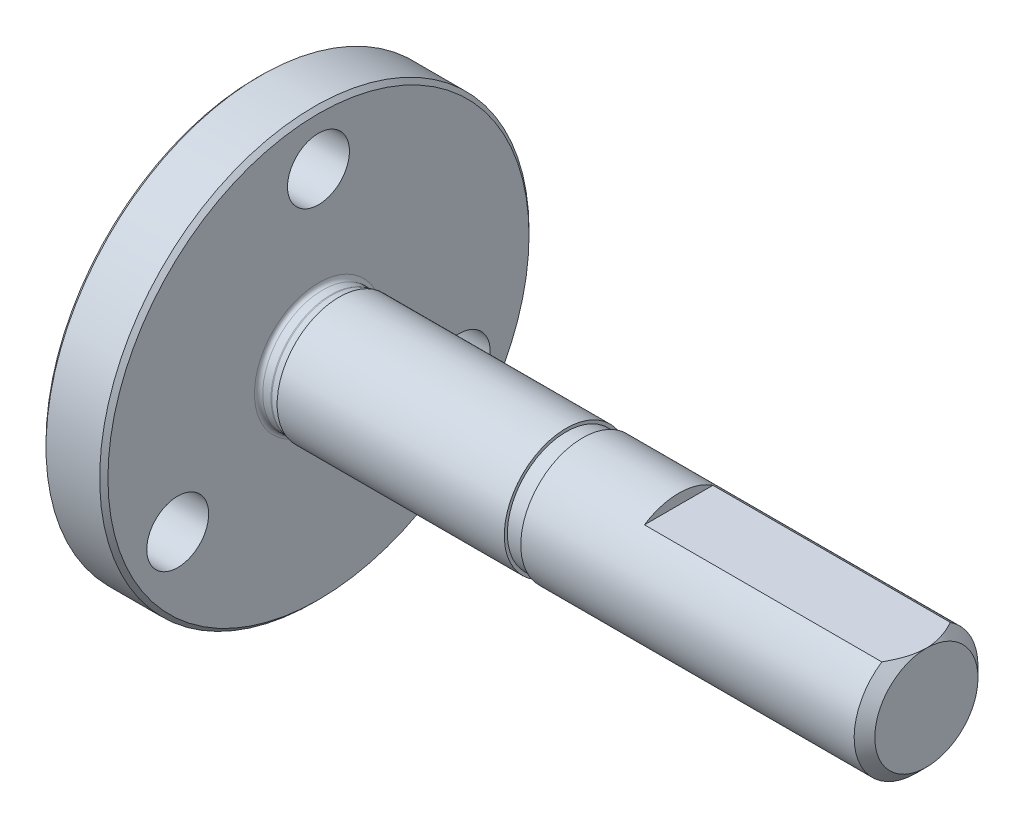
ISO-10303-21;
HEADER;
FILE_DESCRIPTION(('STEP AP214'),'2;1');
FILE_NAME('part.step','',(''),(''),'','','');
FILE_SCHEMA(('AUTOMOTIVE_DESIGN { 1 0 10303 214 1 1 1 1 }'));
ENDSEC;
DATA;
#1=APPLICATION_CONTEXT('core data for automotive mechanical design processes');
#2=APPLICATION_PROTOCOL_DEFINITION('international standard','automotive_design',2000,#1);
#3=PRODUCT_CONTEXT('',#1,'mechanical');
#4=PRODUCT('Part','Part','',(#3));
#5=PRODUCT_RELATED_PRODUCT_CATEGORY('part','',(#4));
#6=PRODUCT_DEFINITION_FORMATION('','',#4);
#7=PRODUCT_DEFINITION_CONTEXT('part definition',#1,'design');
#8=PRODUCT_DEFINITION('design','',#6,#7);
#9=PRODUCT_DEFINITION_SHAPE('','',#8);
#10=(LENGTH_UNIT() NAMED_UNIT(*) SI_UNIT(.MILLI.,.METRE.));
#11=(NAMED_UNIT(*) PLANE_ANGLE_UNIT() SI_UNIT($,.RADIAN.));
#12=(NAMED_UNIT(*) SI_UNIT($,.STERADIAN.) SOLID_ANGLE_UNIT());
#13=UNCERTAINTY_MEASURE_WITH_UNIT(LENGTH_MEASURE(1.E-05),#10,'distance_accuracy_value','');
#14=(GEOMETRIC_REPRESENTATION_CONTEXT(3) GLOBAL_UNCERTAINTY_ASSIGNED_CONTEXT((#13)) GLOBAL_UNIT_ASSIGNED_CONTEXT((#10,
#11,#12)) REPRESENTATION_CONTEXT('',''));
#15=CARTESIAN_POINT('',(0.,0.,0.));
#16=DIRECTION('',(0.,0.,1.));
#17=DIRECTION('',(1.,0.,0.));
#18=AXIS2_PLACEMENT_3D('',#15,#16,#17);
#19=CARTESIAN_POINT('',(-3.,-4.68293605380455E-11,0.));
#20=DIRECTION('',(1.,0.,0.));
#21=DIRECTION('',(0.,0.,-1.));
#22=AXIS2_PLACEMENT_3D('',#19,#20,#21);
#23=CYLINDRICAL_SURFACE('',#22,10.4);
#24=CARTESIAN_POINT('',(-0.20000000000006,-4.68293605380455E-11,0.));
#25=DIRECTION('',(1.,0.,0.));
#26=DIRECTION('',(0.,0.,-1.));
#27=AXIS2_PLACEMENT_3D('',#24,#25,#26);
#28=CIRCLE('',#27,10.4);
#29=CARTESIAN_POINT('',(-0.20000000000006,-4.68293605380455E-11,-10.4));
#30=VERTEX_POINT('',#29);
#31=EDGE_CURVE('E131',#30,#30,#28,.F.);
#32=CARTESIAN_POINT('',(-2.79999999999988,-4.68293605380455E-11,0.));
#33=DIRECTION('',(-1.,0.,0.));
#34=DIRECTION('',(0.,0.,1.));
#35=AXIS2_PLACEMENT_3D('',#32,#33,#34);
#36=CIRCLE('',#35,10.4);
#37=CARTESIAN_POINT('',(-2.79999999999988,-4.68293605380455E-11,-10.4));
#38=VERTEX_POINT('',#37);
#39=EDGE_CURVE('E128',#38,#38,#36,.F.);
#40=CARTESIAN_POINT('',(-0.20000000000006,-4.68293605380455E-11,-10.4));
#41=CARTESIAN_POINT('',(-0.227083333333391,-4.68293605380455E-11,-10.4));
#42=CARTESIAN_POINT('',(-0.254166666666723,-4.68293605380455E-11,-10.4));
#43=CARTESIAN_POINT('',(-0.308333333333386,-4.68293605380455E-11,-10.4));
#44=CARTESIAN_POINT('',(-0.335416666666717,-4.68293605380455E-11,-10.4));
#45=CARTESIAN_POINT('',(-0.38958333333338,-4.68293605380455E-11,-10.4));
#46=CARTESIAN_POINT('',(-0.416666666666712,-4.68293605380455E-11,-10.4));
#47=CARTESIAN_POINT('',(-0.470833333333375,-4.68293605380455E-11,-10.4));
#48=CARTESIAN_POINT('',(-0.497916666666706,-4.68293605380455E-11,-10.4));
#49=CARTESIAN_POINT('',(-0.55208333333337,-4.68293605380455E-11,-10.4));
#50=CARTESIAN_POINT('',(-0.579166666666701,-4.68293605380455E-11,-10.4));
#51=CARTESIAN_POINT('',(-0.633333333333364,-4.68293605380455E-11,-10.4));
#52=CARTESIAN_POINT('',(-0.660416666666696,-4.68293605380455E-11,-10.4));
#53=CARTESIAN_POINT('',(-0.714583333333359,-4.68293605380455E-11,-10.4));
#54=CARTESIAN_POINT('',(-0.74166666666669,-4.68293605380455E-11,-10.4));
#55=CARTESIAN_POINT('',(-0.795833333333353,-4.68293605380455E-11,-10.4));
#56=CARTESIAN_POINT('',(-0.822916666666685,-4.68293605380455E-11,-10.4));
#57=CARTESIAN_POINT('',(-0.877083333333348,-4.68293605380455E-11,-10.4));
#58=CARTESIAN_POINT('',(-0.904166666666679,-4.68293605380455E-11,-10.4));
#59=CARTESIAN_POINT('',(-0.958333333333342,-4.68293605380455E-11,-10.4));
#60=CARTESIAN_POINT('',(-0.985416666666674,-4.68293605380455E-11,-10.4));
#61=CARTESIAN_POINT('',(-1.03958333333334,-4.68293605380455E-11,-10.4));
#62=CARTESIAN_POINT('',(-1.06666666666667,-4.68293605380455E-11,-10.4));
#63=CARTESIAN_POINT('',(-1.12083333333333,-4.68293605380455E-11,-10.4));
#64=CARTESIAN_POINT('',(-1.14791666666666,-4.68293605380455E-11,-10.4));
#65=CARTESIAN_POINT('',(-1.20208333333333,-4.68293605380455E-11,-10.4));
#66=CARTESIAN_POINT('',(-1.22916666666666,-4.68293605380455E-11,-10.4));
#67=CARTESIAN_POINT('',(-1.28333333333332,-4.68293605380455E-11,-10.4));
#68=CARTESIAN_POINT('',(-1.31041666666665,-4.68293605380455E-11,-10.4));
#69=CARTESIAN_POINT('',(-1.36458333333331,-4.68293605380455E-11,-10.4));
#70=CARTESIAN_POINT('',(-1.39166666666665,-4.68293605380455E-11,-10.4));
#71=CARTESIAN_POINT('',(-1.44583333333331,-4.68293605380455E-11,-10.4));
#72=CARTESIAN_POINT('',(-1.47291666666664,-4.68293605380455E-11,-10.4));
#73=CARTESIAN_POINT('',(-1.5270833333333,-4.68293605380455E-11,-10.4));
#74=CARTESIAN_POINT('',(-1.55416666666663,-4.68293605380455E-11,-10.4));
#75=CARTESIAN_POINT('',(-1.6083333333333,-4.68293605380455E-11,-10.4));
#76=CARTESIAN_POINT('',(-1.63541666666663,-4.68293605380455E-11,-10.4));
#77=CARTESIAN_POINT('',(-1.68958333333329,-4.68293605380455E-11,-10.4));
#78=CARTESIAN_POINT('',(-1.71666666666662,-4.68293605380455E-11,-10.4));
#79=CARTESIAN_POINT('',(-1.77083333333329,-4.68293605380455E-11,-10.4));
#80=CARTESIAN_POINT('',(-1.79791666666662,-4.68293605380455E-11,-10.4));
#81=CARTESIAN_POINT('',(-1.85208333333328,-4.68293605380455E-11,-10.4));
#82=CARTESIAN_POINT('',(-1.87916666666661,-4.68293605380455E-11,-10.4));
#83=CARTESIAN_POINT('',(-1.93333333333328,-4.68293605380455E-11,-10.4));
#84=CARTESIAN_POINT('',(-1.96041666666661,-4.68293605380455E-11,-10.4));
#85=CARTESIAN_POINT('',(-2.01458333333327,-4.68293605380455E-11,-10.4));
#86=CARTESIAN_POINT('',(-2.0416666666666,-4.68293605380455E-11,-10.4));
#87=CARTESIAN_POINT('',(-2.09583333333327,-4.68293605380455E-11,-10.4));
#88=CARTESIAN_POINT('',(-2.1229166666666,-4.68293605380455E-11,-10.4));
#89=CARTESIAN_POINT('',(-2.17708333333326,-4.68293605380455E-11,-10.4));
#90=CARTESIAN_POINT('',(-2.20416666666659,-4.68293605380455E-11,-10.4));
#91=CARTESIAN_POINT('',(-2.25833333333325,-4.68293605380455E-11,-10.4));
#92=CARTESIAN_POINT('',(-2.28541666666659,-4.68293605380455E-11,-10.4));
#93=CARTESIAN_POINT('',(-2.33958333333325,-4.68293605380455E-11,-10.4));
#94=CARTESIAN_POINT('',(-2.36666666666658,-4.68293605380455E-11,-10.4));
#95=CARTESIAN_POINT('',(-2.42083333333324,-4.68293605380455E-11,-10.4));
#96=CARTESIAN_POINT('',(-2.44791666666657,-4.68293605380455E-11,-10.4));
#97=CARTESIAN_POINT('',(-2.50208333333324,-4.68293605380455E-11,-10.4));
#98=CARTESIAN_POINT('',(-2.52916666666657,-4.68293605380455E-11,-10.4));
#99=CARTESIAN_POINT('',(-2.58333333333323,-4.68293605380455E-11,-10.4));
#100=CARTESIAN_POINT('',(-2.61041666666656,-4.68293605380455E-11,-10.4));
#101=CARTESIAN_POINT('',(-2.66458333333323,-4.68293605380455E-11,-10.4));
#102=CARTESIAN_POINT('',(-2.69166666666656,-4.68293605380455E-11,-10.4));
#103=CARTESIAN_POINT('',(-2.74583333333322,-4.68293605380455E-11,-10.4));
#104=CARTESIAN_POINT('',(-2.77291666666655,-4.68293605380455E-11,-10.4));
#105=CARTESIAN_POINT('',(-2.79999999999988,-4.68293605380455E-11,-10.4));
#106=B_SPLINE_CURVE_WITH_KNOTS('',3,(#40,#41,#42,#43,#44,#45,#46,#47,#48,#49,#50,#51,#52,#53,
#54,#55,#56,#57,#58,#59,#60,#61,#62,#63,#64,#65,#66,#67,#68,#69,#70,#71,#72,#73,#74,#75,#76,#77,
#78,#79,#80,#81,#82,#83,#84,#85,#86,#87,#88,#89,#90,#91,#92,#93,#94,#95,#96,#97,#98,#99,#100,
#101,#102,#103,#104,#105),.UNSPECIFIED.,.F.,.F.,(4,2,2,2,2,2,2,2,2,2,2,2,2,2,2,2,2,2,2,2,2,2,2,
2,2,2,2,2,2,2,2,2,4),(0.,0.0812499999999945,0.162499999999989,0.243749999999984,
0.324999999999978,0.406249999999973,0.487499999999967,0.568749999999962,0.649999999999956,
0.731249999999951,0.812499999999945,0.893749999999939,0.974999999999934,1.05624999999993,
1.13749999999992,1.21874999999992,1.29999999999991,1.38124999999991,1.4624999999999,
1.5437499999999,1.62499999999989,1.70624999999988,1.78749999999988,1.86874999999987,
1.94999999999987,2.03124999999986,2.11249999999986,2.19374999999985,2.27499999999985,
2.35624999999984,2.43749999999983,2.51874999999983,2.59999999999982),.UNSPECIFIED.);
#107=EDGE_CURVE('BSEAM47',#30,#38,#106,.T.);
#108=ORIENTED_EDGE('',*,*,#31,.T.);
#109=ORIENTED_EDGE('',*,*,#39,.T.);
#110=ORIENTED_EDGE('',*,*,#107,.T.);
#111=ORIENTED_EDGE('',*,*,#107,.F.);
#112=EDGE_LOOP('',(#108,#110,#109,#111));
#113=FACE_BOUND('',#112,.T.);
#114=ADVANCED_FACE('F47',(#113),#23,.T.);
#115=CARTESIAN_POINT('',(-3.,10.3999999999532,0.));
#116=DIRECTION('',(-1.,0.,0.));
#117=DIRECTION('',(0.,0.,1.));
#118=AXIS2_PLACEMENT_3D('',#115,#116,#117);
#119=PLANE('',#118);
#120=CARTESIAN_POINT('',(-3.,-3.9375,-6.819950054802));
#121=DIRECTION('',(-1.,0.,0.));
#122=DIRECTION('',(0.,0.,1.));
#123=AXIS2_PLACEMENT_3D('',#120,#121,#122);
#124=CIRCLE('',#123,1.67320508078337);
#125=CARTESIAN_POINT('',(-3.,-3.9375,-5.14674497401863));
#126=VERTEX_POINT('',#125);
#127=EDGE_CURVE('E149',#126,#126,#124,.F.);
#128=ORIENTED_EDGE('',*,*,#127,.T.);
#129=EDGE_LOOP('',(#128));
#130=FACE_BOUND('',#129,.T.);
#131=CARTESIAN_POINT('',(-3.,-3.9375,6.819950054802));
#132=DIRECTION('',(-1.,0.,0.));
#133=DIRECTION('',(0.,0.,1.));
#134=AXIS2_PLACEMENT_3D('',#131,#132,#133);
#135=CIRCLE('',#134,1.67320508078337);
#136=CARTESIAN_POINT('',(-3.,-3.9375,8.49315513558537));
#137=VERTEX_POINT('',#136);
#138=EDGE_CURVE('E146',#137,#137,#135,.F.);
#139=ORIENTED_EDGE('',*,*,#138,.T.);
#140=EDGE_LOOP('',(#139));
#141=FACE_BOUND('',#140,.T.);
#142=CARTESIAN_POINT('',(-3.,7.875,0.));
#143=DIRECTION('',(-1.,0.,0.));
#144=DIRECTION('',(0.,0.,1.));
#145=AXIS2_PLACEMENT_3D('',#142,#143,#144);
#146=CIRCLE('',#145,1.67320508075305);
#147=CARTESIAN_POINT('',(-3.,7.875,1.67320508075305));
#148=VERTEX_POINT('',#147);
#149=EDGE_CURVE('E140',#148,#148,#146,.F.);
#150=ORIENTED_EDGE('',*,*,#149,.T.);
#151=EDGE_LOOP('',(#150));
#152=FACE_BOUND('',#151,.T.);
#153=CARTESIAN_POINT('',(-3.,-4.68293605380455E-11,0.));
#154=DIRECTION('',(-1.,0.,0.));
#155=DIRECTION('',(0.,0.,1.));
#156=AXIS2_PLACEMENT_3D('',#153,#154,#155);
#157=CIRCLE('',#156,10.1999999999999);
#158=CARTESIAN_POINT('',(-3.,-4.68293605380455E-11,-10.1999999999999));
#159=VERTEX_POINT('',#158);
#160=EDGE_CURVE('E134',#159,#159,#157,.T.);
#161=ORIENTED_EDGE('',*,*,#160,.T.);
#162=EDGE_LOOP('',(#161));
#163=FACE_BOUND('',#162,.T.);
#164=CARTESIAN_POINT('',(-3.,0.,0.));
#165=DIRECTION('',(-1.,0.,0.));
#166=DIRECTION('',(0.,0.,1.));
#167=AXIS2_PLACEMENT_3D('',#164,#165,#166);
#168=CIRCLE('',#167,5.00000000002389);
#169=CARTESIAN_POINT('',(-3.,0.,5.00000000002389));
#170=VERTEX_POINT('',#169);
#171=EDGE_CURVE('E89',#170,#170,#168,.T.);
#172=ORIENTED_EDGE('',*,*,#171,.F.);
#173=EDGE_LOOP('',(#172));
#174=FACE_BOUND('',#173,.T.);
#175=ADVANCED_FACE('F212',(#130,#141,#152,#163,#174),#119,.T.);
#176=CARTESIAN_POINT('',(29.45,-4.68293605380455E-11,0.));
#177=DIRECTION('',(1.,0.,0.));
#178=DIRECTION('',(0.,0.,-1.));
#179=AXIS2_PLACEMENT_3D('',#176,#177,#178);
#180=PLANE('',#179);
#181=CARTESIAN_POINT('',(29.45,-4.68293605380455E-11,0.));
#182=DIRECTION('',(1.,0.,0.));
#183=DIRECTION('',(0.,0.,-1.));
#184=AXIS2_PLACEMENT_3D('',#181,#182,#183);
#185=CIRCLE('',#184,2.50000000001932);
#186=CARTESIAN_POINT('',(29.45,2.49999999997249,0.));
#187=VERTEX_POINT('',#186);
#188=EDGE_CURVE('E119',#187,#187,#185,.T.);
#189=ORIENTED_EDGE('',*,*,#188,.T.);
#190=EDGE_LOOP('',(#189));
#191=FACE_BOUND('',#190,.T.);
#192=ADVANCED_FACE('F217',(#191),#180,.T.);
#193=CARTESIAN_POINT('',(-3.,-4.68293605380455E-11,0.));
#194=DIRECTION('',(1.,0.,0.));
#195=DIRECTION('',(0.,0.,-1.));
#196=AXIS2_PLACEMENT_3D('',#193,#194,#195);
#197=CYLINDRICAL_SURFACE('',#196,3.00000000004683);
#198=DIRECTION('',(1.,0.,0.));
#199=VECTOR('',#198,1.);
#200=CARTESIAN_POINT('',(-3.,2.5,-1.65831239519182));
#201=LINE('',#200,#199);
#202=CARTESIAN_POINT('',(28.9500000000862,2.5,-1.65831239519182));
#203=VERTEX_POINT('',#202);
#204=CARTESIAN_POINT('',(17.45,2.5,-1.65831239519182));
#205=VERTEX_POINT('',#204);
#206=EDGE_CURVE('E81',#203,#205,#201,.F.);
#207=ORIENTED_EDGE('',*,*,#206,.F.);
#208=CARTESIAN_POINT('',(28.9500000000862,-4.68293605380455E-11,0.));
#209=DIRECTION('',(1.,0.,0.));
#210=DIRECTION('',(0.,0.,-1.));
#211=AXIS2_PLACEMENT_3D('',#208,#209,#210);
#212=CIRCLE('',#211,3.00000000004683);
#213=CARTESIAN_POINT('',(28.9500000000862,2.5,1.65831239519182));
#214=VERTEX_POINT('',#213);
#215=EDGE_CURVE('E87',#203,#214,#212,.F.);
#216=ORIENTED_EDGE('',*,*,#215,.T.);
#217=DIRECTION('',(1.,0.,0.));
#218=VECTOR('',#217,1.);
#219=CARTESIAN_POINT('',(-3.,2.5,1.65831239519182));
#220=LINE('',#219,#218);
#221=CARTESIAN_POINT('',(17.45,2.5,1.65831239519182));
#222=VERTEX_POINT('',#221);
#223=EDGE_CURVE('E66',#222,#214,#220,.T.);
#224=ORIENTED_EDGE('',*,*,#223,.F.);
#225=CARTESIAN_POINT('',(17.45,-4.68293605380455E-11,0.));
#226=DIRECTION('',(-1.,0.,0.));
#227=DIRECTION('',(0.,0.,1.));
#228=AXIS2_PLACEMENT_3D('',#225,#226,#227);
#229=CIRCLE('',#228,3.00000000004683);
#230=EDGE_CURVE('E13',#205,#222,#229,.F.);
#231=ORIENTED_EDGE('',*,*,#230,.F.);
#232=EDGE_LOOP('',(#207,#216,#224,#231));
#233=FACE_BOUND('',#232,.T.);
#234=CARTESIAN_POINT('',(12.8,-4.68293605380455E-11,0.));
#235=DIRECTION('',(1.,0.,0.));
#236=DIRECTION('',(0.,0.,-1.));
#237=AXIS2_PLACEMENT_3D('',#234,#235,#236);
#238=CIRCLE('',#237,3.00000000004683);
#239=CARTESIAN_POINT('',(12.8,-4.68293605380455E-11,-3.00000000004683));
#240=VERTEX_POINT('',#239);
#241=EDGE_CURVE('E116',#240,#240,#238,.T.);
#242=ORIENTED_EDGE('',*,*,#241,.T.);
#243=EDGE_LOOP('',(#242));
#244=FACE_BOUND('',#243,.T.);
#245=ADVANCED_FACE('F84',(#233,#244),#197,.T.);
#246=CARTESIAN_POINT('',(12.8,3.,0.));
#247=DIRECTION('',(-1.,0.,0.));
#248=DIRECTION('',(0.,0.,1.));
#249=AXIS2_PLACEMENT_3D('',#246,#247,#248);
#250=PLANE('',#249);
#251=CARTESIAN_POINT('',(12.8,-4.68293605380455E-11,0.));
#252=DIRECTION('',(1.,0.,0.));
#253=DIRECTION('',(0.,0.,-1.));
#254=AXIS2_PLACEMENT_3D('',#251,#252,#253);
#255=CIRCLE('',#254,2.85000000004683);
#256=CARTESIAN_POINT('',(12.8,-4.68293605380455E-11,-2.85000000004683));
#257=VERTEX_POINT('',#256);
#258=EDGE_CURVE('E113',#257,#257,#255,.T.);
#259=ORIENTED_EDGE('',*,*,#258,.T.);
#260=EDGE_LOOP('',(#259));
#261=FACE_BOUND('',#260,.T.);
#262=ORIENTED_EDGE('',*,*,#241,.F.);
#263=EDGE_LOOP('',(#262));
#264=FACE_BOUND('',#263,.T.);
#265=ADVANCED_FACE('F269',(#261,#264),#250,.T.);
#266=CARTESIAN_POINT('',(-3.,-4.68293605380455E-11,0.));
#267=DIRECTION('',(1.,0.,0.));
#268=DIRECTION('',(0.,0.,-1.));
#269=AXIS2_PLACEMENT_3D('',#266,#267,#268);
#270=CYLINDRICAL_SURFACE('',#269,2.85000000004683);
#271=CARTESIAN_POINT('',(12.,-4.68293605380455E-11,0.));
#272=DIRECTION('',(1.,0.,0.));
#273=DIRECTION('',(0.,0.,-1.));
#274=AXIS2_PLACEMENT_3D('',#271,#272,#273);
#275=CIRCLE('',#274,2.85000000004683);
#276=CARTESIAN_POINT('',(12.,-4.68293605380455E-11,-2.85000000004683));
#277=VERTEX_POINT('',#276);
#278=EDGE_CURVE('E110',#277,#277,#275,.T.);
#279=ORIENTED_EDGE('',*,*,#278,.T.);
#280=EDGE_LOOP('',(#279));
#281=FACE_BOUND('',#280,.T.);
#282=ORIENTED_EDGE('',*,*,#258,.F.);
#283=EDGE_LOOP('',(#282));
#284=FACE_BOUND('',#283,.T.);
#285=ADVANCED_FACE('F265',(#281,#284),#270,.T.);
#286=CARTESIAN_POINT('',(12.,2.85,0.));
#287=DIRECTION('',(1.,0.,0.));
#288=DIRECTION('',(0.,0.,-1.));
#289=AXIS2_PLACEMENT_3D('',#286,#287,#288);
#290=PLANE('',#289);
#291=CARTESIAN_POINT('',(12.,-4.68293605380455E-11,0.));
#292=DIRECTION('',(1.,0.,0.));
#293=DIRECTION('',(0.,0.,-1.));
#294=AXIS2_PLACEMENT_3D('',#291,#292,#293);
#295=CIRCLE('',#294,3.00000000004683);
#296=CARTESIAN_POINT('',(12.,-4.68293605380455E-11,-3.00000000004683));
#297=VERTEX_POINT('',#296);
#298=EDGE_CURVE('E107',#297,#297,#295,.T.);
#299=ORIENTED_EDGE('',*,*,#298,.T.);
#300=EDGE_LOOP('',(#299));
#301=FACE_BOUND('',#300,.T.);
#302=ORIENTED_EDGE('',*,*,#278,.F.);
#303=EDGE_LOOP('',(#302));
#304=FACE_BOUND('',#303,.T.);
#305=ADVANCED_FACE('F261',(#301,#304),#290,.T.);
#306=CARTESIAN_POINT('',(-3.,-4.68293605380455E-11,0.));
#307=DIRECTION('',(1.,0.,0.));
#308=DIRECTION('',(0.,0.,-1.));
#309=AXIS2_PLACEMENT_3D('',#306,#307,#308);
#310=CYLINDRICAL_SURFACE('',#309,3.00000000004683);
#311=CARTESIAN_POINT('',(0.996794919331024,-4.68293605380455E-11,0.));
#312=DIRECTION('',(1.,0.,0.));
#313=DIRECTION('',(0.,0.,-1.));
#314=AXIS2_PLACEMENT_3D('',#311,#312,#313);
#315=CIRCLE('',#314,3.00000000004683);
#316=CARTESIAN_POINT('',(0.996794919331024,-4.68293605380455E-11,-3.00000000004683));
#317=VERTEX_POINT('',#316);
#318=EDGE_CURVE('E104',#317,#317,#315,.T.);
#319=ORIENTED_EDGE('',*,*,#318,.T.);
#320=EDGE_LOOP('',(#319));
#321=FACE_BOUND('',#320,.T.);
#322=ORIENTED_EDGE('',*,*,#298,.F.);
#323=EDGE_LOOP('',(#322));
#324=FACE_BOUND('',#323,.T.);
#325=ADVANCED_FACE('F257',(#321,#324),#310,.T.);
#326=CARTESIAN_POINT('',(0.996794919331024,-4.68293605380455E-11,0.));
#327=DIRECTION('',(1.,0.,0.));
#328=DIRECTION('',(0.,0.,-1.));
#329=AXIS2_PLACEMENT_3D('',#326,#327,#328);
#330=CONICAL_SURFACE('',#329,3.00000000004683,0.26179938774434);
#331=CARTESIAN_POINT('',(0.64902314781557,-4.68293605380455E-11,0.));
#332=DIRECTION('',(1.,0.,0.));
#333=DIRECTION('',(0.,0.,-1.));
#334=AXIS2_PLACEMENT_3D('',#331,#332,#333);
#335=CIRCLE('',#334,2.90681483473935);
#336=CARTESIAN_POINT('',(0.64902314781557,-4.68293605380455E-11,-2.90681483473935));
#337=VERTEX_POINT('',#336);
#338=EDGE_CURVE('E164',#337,#337,#335,.T.);
#339=ORIENTED_EDGE('',*,*,#338,.T.);
#340=EDGE_LOOP('',(#339));
#341=FACE_BOUND('',#340,.T.);
#342=ORIENTED_EDGE('',*,*,#318,.F.);
#343=EDGE_LOOP('',(#342));
#344=FACE_BOUND('',#343,.T.);
#345=ADVANCED_FACE('F253',(#341,#344),#330,.T.);
#346=CARTESIAN_POINT('',(-3.,-4.68293605380455E-11,0.));
#347=DIRECTION('',(1.,0.,0.));
#348=DIRECTION('',(0.,0.,-1.));
#349=AXIS2_PLACEMENT_3D('',#346,#347,#348);
#350=CYLINDRICAL_SURFACE('',#349,2.9);
#351=CARTESIAN_POINT('',(0.200000000000035,-4.68293605380455E-11,0.));
#352=DIRECTION('',(1.,0.,0.));
#353=DIRECTION('',(0.,0.,-1.));
#354=AXIS2_PLACEMENT_3D('',#351,#352,#353);
#355=CIRCLE('',#354,2.9);
#356=CARTESIAN_POINT('',(0.200000000000035,-4.68293605380455E-11,-2.9));
#357=VERTEX_POINT('',#356);
#358=EDGE_CURVE('E158',#357,#357,#355,.T.);
#359=ORIENTED_EDGE('',*,*,#358,.T.);
#360=EDGE_LOOP('',(#359));
#361=FACE_BOUND('',#360,.T.);
#362=CARTESIAN_POINT('',(0.597259338805646,-4.68293605380455E-11,0.));
#363=DIRECTION('',(1.,0.,0.));
#364=DIRECTION('',(0.,0.,-1.));
#365=AXIS2_PLACEMENT_3D('',#362,#363,#364);
#366=CIRCLE('',#365,2.9);
#367=CARTESIAN_POINT('',(0.597259338805646,-4.68293605380455E-11,-2.9));
#368=VERTEX_POINT('',#367);
#369=EDGE_CURVE('E155',#368,#368,#366,.F.);
#370=ORIENTED_EDGE('',*,*,#369,.T.);
#371=EDGE_LOOP('',(#370));
#372=FACE_BOUND('',#371,.T.);
#373=ADVANCED_FACE('F230',(#361,#372),#350,.T.);
#374=CARTESIAN_POINT('',(0.,2.89999999995317,0.));
#375=DIRECTION('',(1.,0.,0.));
#376=DIRECTION('',(0.,0.,-1.));
#377=AXIS2_PLACEMENT_3D('',#374,#375,#376);
#378=PLANE('',#377);
#379=CARTESIAN_POINT('',(0.,-4.68293605380455E-11,0.));
#380=DIRECTION('',(1.,0.,0.));
#381=DIRECTION('',(0.,0.,-1.));
#382=AXIS2_PLACEMENT_3D('',#379,#380,#381);
#383=CIRCLE('',#382,3.10000000000004);
#384=CARTESIAN_POINT('',(0.,-4.68293605380455E-11,-3.10000000000004));
#385=VERTEX_POINT('',#384);
#386=EDGE_CURVE('E161',#385,#385,#383,.F.);
#387=ORIENTED_EDGE('',*,*,#386,.T.);
#388=EDGE_LOOP('',(#387));
#389=FACE_BOUND('',#388,.T.);
#390=CARTESIAN_POINT('',(0.,-4.68293605380455E-11,0.));
#391=DIRECTION('',(1.,0.,0.));
#392=DIRECTION('',(0.,0.,-1.));
#393=AXIS2_PLACEMENT_3D('',#390,#391,#392);
#394=CIRCLE('',#393,10.1999999999999);
#395=CARTESIAN_POINT('',(0.,-4.68293605380455E-11,-10.1999999999999));
#396=VERTEX_POINT('',#395);
#397=EDGE_CURVE('E125',#396,#396,#394,.T.);
#398=ORIENTED_EDGE('',*,*,#397,.T.);
#399=EDGE_LOOP('',(#398));
#400=FACE_BOUND('',#399,.T.);
#401=CARTESIAN_POINT('',(0.,-3.9375,-6.819950054802));
#402=DIRECTION('',(1.,0.,0.));
#403=DIRECTION('',(0.,0.,-1.));
#404=AXIS2_PLACEMENT_3D('',#401,#402,#403);
#405=CIRCLE('',#404,1.49999999999999);
#406=CARTESIAN_POINT('',(0.,-3.9375,-8.31995005480199));
#407=VERTEX_POINT('',#406);
#408=EDGE_CURVE('E97',#407,#407,#405,.T.);
#409=ORIENTED_EDGE('',*,*,#408,.F.);
#410=EDGE_LOOP('',(#409));
#411=FACE_BOUND('',#410,.T.);
#412=CARTESIAN_POINT('',(0.,-3.9375,6.819950054802));
#413=DIRECTION('',(1.,0.,0.));
#414=DIRECTION('',(0.,0.,-1.));
#415=AXIS2_PLACEMENT_3D('',#412,#413,#414);
#416=CIRCLE('',#415,1.49999999999999);
#417=CARTESIAN_POINT('',(0.,-3.9375,5.31995005480201));
#418=VERTEX_POINT('',#417);
#419=EDGE_CURVE('E98',#418,#418,#416,.T.);
#420=ORIENTED_EDGE('',*,*,#419,.F.);
#421=EDGE_LOOP('',(#420));
#422=FACE_BOUND('',#421,.T.);
#423=CARTESIAN_POINT('',(0.,7.875,0.));
#424=DIRECTION('',(1.,0.,0.));
#425=DIRECTION('',(0.,0.,-1.));
#426=AXIS2_PLACEMENT_3D('',#423,#424,#425);
#427=CIRCLE('',#426,1.49999999999999);
#428=CARTESIAN_POINT('',(0.,7.875,-1.49999999999999));
#429=VERTEX_POINT('',#428);
#430=EDGE_CURVE('E101',#429,#429,#427,.T.);
#431=ORIENTED_EDGE('',*,*,#430,.F.);
#432=EDGE_LOOP('',(#431));
#433=FACE_BOUND('',#432,.T.);
#434=ADVANCED_FACE('F226',(#389,#400,#411,#422,#433),#378,.T.);
#435=CARTESIAN_POINT('',(-3.,7.875,0.));
#436=DIRECTION('',(-1.,0.,0.));
#437=DIRECTION('',(0.,0.,1.));
#438=AXIS2_PLACEMENT_3D('',#435,#436,#437);
#439=CYLINDRICAL_SURFACE('',#438,1.49999999999999);
#440=CARTESIAN_POINT('',(-2.70000000001616,7.875,0.));
#441=DIRECTION('',(-1.,0.,0.));
#442=DIRECTION('',(0.,0.,1.));
#443=AXIS2_PLACEMENT_3D('',#440,#441,#442);
#444=CIRCLE('',#443,1.49999999999999);
#445=CARTESIAN_POINT('',(-2.70000000001616,7.875,1.49999999999999));
#446=VERTEX_POINT('',#445);
#447=EDGE_CURVE('E137',#446,#446,#444,.T.);
#448=ORIENTED_EDGE('',*,*,#447,.T.);
#449=EDGE_LOOP('',(#448));
#450=FACE_BOUND('',#449,.T.);
#451=ORIENTED_EDGE('',*,*,#430,.T.);
#452=EDGE_LOOP('',(#451));
#453=FACE_BOUND('',#452,.T.);
#454=ADVANCED_FACE('F229',(#450,#453),#439,.F.);
#455=CARTESIAN_POINT('',(-3.,-3.9375,6.819950054802));
#456=DIRECTION('',(-1.,0.,0.));
#457=DIRECTION('',(0.,0.,1.));
#458=AXIS2_PLACEMENT_3D('',#455,#456,#457);
#459=CYLINDRICAL_SURFACE('',#458,1.49999999999999);
#460=CARTESIAN_POINT('',(-2.69999999996365,-3.9375,6.819950054802));
#461=DIRECTION('',(-1.,0.,0.));
#462=DIRECTION('',(0.,0.,1.));
#463=AXIS2_PLACEMENT_3D('',#460,#461,#462);
#464=CIRCLE('',#463,1.49999999999999);
#465=CARTESIAN_POINT('',(-2.69999999996365,-3.9375,8.31995005480199));
#466=VERTEX_POINT('',#465);
#467=EDGE_CURVE('E152',#466,#466,#464,.T.);
#468=ORIENTED_EDGE('',*,*,#467,.T.);
#469=EDGE_LOOP('',(#468));
#470=FACE_BOUND('',#469,.T.);
#471=ORIENTED_EDGE('',*,*,#419,.T.);
#472=EDGE_LOOP('',(#471));
#473=FACE_BOUND('',#472,.T.);
#474=ADVANCED_FACE('F240',(#470,#473),#459,.F.);
#475=CARTESIAN_POINT('',(-3.,-3.9375,-6.819950054802));
#476=DIRECTION('',(-1.,0.,0.));
#477=DIRECTION('',(0.,0.,1.));
#478=AXIS2_PLACEMENT_3D('',#475,#476,#477);
#479=CYLINDRICAL_SURFACE('',#478,1.49999999999999);
#480=CARTESIAN_POINT('',(-2.69999999996364,-3.9375,-6.819950054802));
#481=DIRECTION('',(-1.,0.,0.));
#482=DIRECTION('',(0.,0.,1.));
#483=AXIS2_PLACEMENT_3D('',#480,#481,#482);
#484=CIRCLE('',#483,1.49999999999999);
#485=CARTESIAN_POINT('',(-2.69999999996364,-3.9375,-5.31995005480201));
#486=VERTEX_POINT('',#485);
#487=EDGE_CURVE('E143',#486,#486,#484,.T.);
#488=ORIENTED_EDGE('',*,*,#487,.T.);
#489=EDGE_LOOP('',(#488));
#490=FACE_BOUND('',#489,.T.);
#491=ORIENTED_EDGE('',*,*,#408,.T.);
#492=EDGE_LOOP('',(#491));
#493=FACE_BOUND('',#492,.T.);
#494=ADVANCED_FACE('F246',(#490,#493),#479,.F.);
#495=CARTESIAN_POINT('',(-2.50000000001182,0.,0.));
#496=DIRECTION('',(1.,0.,0.));
#497=DIRECTION('',(0.,0.,-1.));
#498=AXIS2_PLACEMENT_3D('',#495,#496,#497);
#499=PLANE('',#498);
#500=CARTESIAN_POINT('',(-2.50000000001182,0.,0.));
#501=DIRECTION('',(-1.,0.,0.));
#502=DIRECTION('',(0.,0.,1.));
#503=AXIS2_PLACEMENT_3D('',#500,#501,#502);
#504=CIRCLE('',#503,4.8660254038282);
#505=CARTESIAN_POINT('',(-2.50000000001182,0.,4.8660254038282));
#506=VERTEX_POINT('',#505);
#507=EDGE_CURVE('E94',#506,#506,#504,.T.);
#508=ORIENTED_EDGE('',*,*,#507,.T.);
#509=EDGE_LOOP('',(#508));
#510=FACE_BOUND('',#509,.T.);
#511=ADVANCED_FACE('F391',(#510),#499,.F.);
#512=CARTESIAN_POINT('',(-3.,0.,0.));
#513=DIRECTION('',(-1.,0.,0.));
#514=DIRECTION('',(0.,0.,1.));
#515=AXIS2_PLACEMENT_3D('',#512,#513,#514);
#516=CONICAL_SURFACE('',#515,5.00000000002389,0.261799387767973);
#517=ORIENTED_EDGE('',*,*,#507,.F.);
#518=EDGE_LOOP('',(#517));
#519=FACE_BOUND('',#518,.T.);
#520=ORIENTED_EDGE('',*,*,#171,.T.);
#521=EDGE_LOOP('',(#520));
#522=FACE_BOUND('',#521,.T.);
#523=ADVANCED_FACE('F181',(#519,#522),#516,.F.);
#524=CARTESIAN_POINT('',(29.45,-4.68293605380455E-11,0.));
#525=DIRECTION('',(-1.,0.,0.));
#526=DIRECTION('',(0.,0.,1.));
#527=AXIS2_PLACEMENT_3D('',#524,#525,#526);
#528=CONICAL_SURFACE('',#527,2.50000000001932,0.785398163511131);
#529=CARTESIAN_POINT('',(26.4458289100685,2.5,-4.90366183527529));
#530=CARTESIAN_POINT('',(26.5465429766099,2.5,-4.79059675326038));
#531=CARTESIAN_POINT('',(26.6468745739565,2.5,-4.6771877472055));
#532=CARTESIAN_POINT('',(26.8465687132127,2.5,-4.44949963967197));
#533=CARTESIAN_POINT('',(26.9459311544368,2.5,-4.33522044994059));
#534=CARTESIAN_POINT('',(27.1438765486381,2.5,-4.10515116002013));
#535=CARTESIAN_POINT('',(27.2424544804753,2.5,-3.98935673175883));
#536=CARTESIAN_POINT('',(27.4380932264582,2.5,-3.75650026423527));
#537=CARTESIAN_POINT('',(27.5351541112541,2.5,-3.63943828443641));
#538=CARTESIAN_POINT('',(27.7331145886674,2.5,-3.3966687956957));
#539=CARTESIAN_POINT('',(27.8338951481663,2.5,-3.27086393413979));
#540=CARTESIAN_POINT('',(28.0325886569984,2.5,-3.0170118968256));
#541=CARTESIAN_POINT('',(28.1305017831253,2.5,-2.88896486009143));
#542=CARTESIAN_POINT('',(28.3222774109731,2.5,-2.63019247914758));
#543=CARTESIAN_POINT('',(28.4161464536266,2.5,-2.49947200611505));
#544=CARTESIAN_POINT('',(28.5984522094427,2.5,-2.23431628391257));
#545=CARTESIAN_POINT('',(28.6868908041252,2.5,-2.09988234504373));
#546=CARTESIAN_POINT('',(28.8309175522405,2.5,-1.86665343162737));
#547=CARTESIAN_POINT('',(28.8884820347206,2.5,-1.76908510633624));
#548=CARTESIAN_POINT('',(28.9984988847396,2.5,-1.57103442613667));
#549=CARTESIAN_POINT('',(29.0509496039122,2.5,-1.47055114507762));
#550=CARTESIAN_POINT('',(29.1486054833188,2.5,-1.26716191789669));
#551=CARTESIAN_POINT('',(29.1938698314261,2.5,-1.16428473461772));
#552=CARTESIAN_POINT('',(29.275513984682,2.5,-0.955052938685874));
#553=CARTESIAN_POINT('',(29.3118997164469,2.5,-0.84870069975349));
#554=CARTESIAN_POINT('',(29.3632561397649,2.5,-0.667918776041665));
#555=CARTESIAN_POINT('',(29.3813417923787,2.5,-0.594375466617219));
#556=CARTESIAN_POINT('',(29.4115533496421,2.5,-0.446066762616555));
#557=CARTESIAN_POINT('',(29.423680283249,2.5,-0.3713015813399));
#558=CARTESIAN_POINT('',(29.4413299049261,2.5,-0.221254320795904));
#559=CARTESIAN_POINT('',(29.4468759209302,2.5,-0.145975024484081));
#560=CARTESIAN_POINT('',(29.4511308833209,2.5,0.00478037237883807));
#561=CARTESIAN_POINT('',(29.4498398126916,2.5,0.0802564734192651));
#562=CARTESIAN_POINT('',(29.4405180913759,2.5,0.230410617594781));
#563=CARTESIAN_POINT('',(29.4325206837378,2.5,0.305090760600554));
#564=CARTESIAN_POINT('',(29.4102585225289,2.5,0.453514643225039));
#565=CARTESIAN_POINT('',(29.39599228154,2.5,0.52725815633254));
#566=CARTESIAN_POINT('',(29.361671404095,2.5,0.674250691385394));
#567=CARTESIAN_POINT('',(29.3415530029359,2.5,0.747484639012929));
#568=CARTESIAN_POINT('',(29.2963967488838,2.5,0.89238511772647));
#569=CARTESIAN_POINT('',(29.2713598044677,2.5,0.964051935555875));
#570=CARTESIAN_POINT('',(29.2081633569585,2.5,1.12928116870054));
#571=CARTESIAN_POINT('',(29.1684047091883,2.5,1.22222916747016));
#572=CARTESIAN_POINT('',(29.0831573377143,2.5,1.40547921005439));
#573=CARTESIAN_POINT('',(29.0376654722958,2.5,1.49577976941378));
#574=CARTESIAN_POINT('',(28.9420732552646,2.5,1.67431385729612));
#575=CARTESIAN_POINT('',(28.8919566574676,2.5,1.76253861818294));
#576=CARTESIAN_POINT('',(28.7882556585851,2.5,1.93688820735474));
#577=CARTESIAN_POINT('',(28.7346719308995,2.5,2.02301343897159));
#578=CARTESIAN_POINT('',(28.6275093857452,2.5,2.18924058656568));
#579=CARTESIAN_POINT('',(28.5740635744803,2.5,2.26942869642489));
#580=CARTESIAN_POINT('',(28.4651775868598,2.5,2.42844442322941));
#581=CARTESIAN_POINT('',(28.4097372506846,2.5,2.50727193039854));
#582=CARTESIAN_POINT('',(28.2977369658254,2.5,2.66306918762548));
#583=CARTESIAN_POINT('',(28.241191241975,2.5,2.74004919913673));
#584=CARTESIAN_POINT('',(28.1267931508262,2.5,2.89300140759558));
#585=CARTESIAN_POINT('',(28.0689411341076,2.5,2.9689738664601));
#586=CARTESIAN_POINT('',(28.0105616780923,2.5,3.04453186789223));
#587=B_SPLINE_CURVE_WITH_KNOTS('',3,(#529,#530,#531,#532,#533,#534,#535,#536,#537,#538,#539,
#540,#541,#542,#543,#544,#545,#546,#547,#548,#549,#550,#551,#552,#553,#554,#555,#556,#557,#558,
#559,#560,#561,#562,#563,#564,#565,#566,#567,#568,#569,#570,#571,#572,#573,#574,#575,#576,#577,
#578,#579,#580,#581,#582,#583,#584,#585,#586),.UNSPECIFIED.,.F.,.F.,(4,2,2,2,2,2,2,2,2,2,2,2,2,
2,2,2,2,2,2,2,2,2,2,2,2,2,2,2,4),(0.,0.454253017031967,0.908552734178425,1.36475897194903,
1.82094390009783,2.30449620814189,2.78801863937546,3.27072716335859,3.75326748557486,
4.09300641780947,4.43285450163817,4.76973938566465,5.10639877475557,5.3333932996407,
5.56034861310839,5.78649699244125,6.01264593460187,6.23768044679875,6.46276838222749,
6.69040712097193,6.91800385328312,7.22102383585806,7.52421059665392,7.8285062066265,
8.13274289146473,8.42180800850049,8.71089633989462,8.99742981324616,9.28388728056323),.UNSPECIFIED.);
#588=EDGE_CURVE('E55',#214,#187,#587,.F.);
#589=ORIENTED_EDGE('',*,*,#588,.F.);
#590=ORIENTED_EDGE('',*,*,#215,.F.);
#591=EDGE_CURVE('E166',#187,#203,#587,.F.);
#592=ORIENTED_EDGE('',*,*,#591,.F.);
#593=ORIENTED_EDGE('',*,*,#188,.F.);
#594=EDGE_LOOP('',(#589,#590,#592,#593));
#595=FACE_BOUND('',#594,.T.);
#596=ADVANCED_FACE('F175',(#595),#528,.T.);
#597=CARTESIAN_POINT('',(0.,-4.68293605380455E-11,0.));
#598=DIRECTION('',(-1.,0.,0.));
#599=DIRECTION('',(0.,0.,1.));
#600=AXIS2_PLACEMENT_3D('',#597,#598,#599);
#601=CONICAL_SURFACE('',#600,10.1999999999999,0.785398163397591);
#602=ORIENTED_EDGE('',*,*,#31,.F.);
#603=EDGE_LOOP('',(#602));
#604=FACE_BOUND('',#603,.T.);
#605=ORIENTED_EDGE('',*,*,#397,.F.);
#606=EDGE_LOOP('',(#605));
#607=FACE_BOUND('',#606,.T.);
#608=ADVANCED_FACE('F180',(#604,#607),#601,.T.);
#609=CARTESIAN_POINT('',(-2.79999999999988,-4.68293605380455E-11,0.));
#610=DIRECTION('',(1.,0.,0.));
#611=DIRECTION('',(0.,0.,-1.));
#612=AXIS2_PLACEMENT_3D('',#609,#610,#611);
#613=CONICAL_SURFACE('',#612,10.4,0.785398163397305);
#614=CARTESIAN_POINT('',(-3.,-4.68293605380455E-11,-10.1999999999999));
#615=CARTESIAN_POINT('',(-2.99791666666667,-4.68293605380455E-11,-10.2020833333333));
#616=CARTESIAN_POINT('',(-2.99583333333333,-4.68293605380455E-11,-10.2041666666666));
#617=CARTESIAN_POINT('',(-2.99166666666666,-4.68293605380455E-11,-10.2083333333333));
#618=CARTESIAN_POINT('',(-2.98958333333333,-4.68293605380455E-11,-10.2104166666666));
#619=CARTESIAN_POINT('',(-2.98541666666666,-4.68293605380455E-11,-10.2145833333333));
#620=CARTESIAN_POINT('',(-2.98333333333332,-4.68293605380455E-11,-10.2166666666666));
#621=CARTESIAN_POINT('',(-2.97916666666665,-4.68293605380455E-11,-10.2208333333333));
#622=CARTESIAN_POINT('',(-2.97708333333332,-4.68293605380455E-11,-10.2229166666666));
#623=CARTESIAN_POINT('',(-2.97291666666665,-4.68293605380455E-11,-10.2270833333333));
#624=CARTESIAN_POINT('',(-2.97083333333332,-4.68293605380455E-11,-10.2291666666666));
#625=CARTESIAN_POINT('',(-2.96666666666665,-4.68293605380455E-11,-10.2333333333333));
#626=CARTESIAN_POINT('',(-2.96458333333331,-4.68293605380455E-11,-10.2354166666666));
#627=CARTESIAN_POINT('',(-2.96041666666664,-4.68293605380455E-11,-10.2395833333333));
#628=CARTESIAN_POINT('',(-2.95833333333331,-4.68293605380455E-11,-10.2416666666666));
#629=CARTESIAN_POINT('',(-2.95416666666664,-4.68293605380455E-11,-10.2458333333333));
#630=CARTESIAN_POINT('',(-2.9520833333333,-4.68293605380455E-11,-10.2479166666666));
#631=CARTESIAN_POINT('',(-2.94791666666664,-4.68293605380455E-11,-10.2520833333333));
#632=CARTESIAN_POINT('',(-2.9458333333333,-4.68293605380455E-11,-10.2541666666666));
#633=CARTESIAN_POINT('',(-2.94166666666663,-4.68293605380455E-11,-10.2583333333333));
#634=CARTESIAN_POINT('',(-2.9395833333333,-4.68293605380455E-11,-10.2604166666666));
#635=CARTESIAN_POINT('',(-2.93541666666663,-4.68293605380455E-11,-10.2645833333333));
#636=CARTESIAN_POINT('',(-2.93333333333329,-4.68293605380455E-11,-10.2666666666666));
#637=CARTESIAN_POINT('',(-2.92916666666662,-4.68293605380455E-11,-10.2708333333333));
#638=CARTESIAN_POINT('',(-2.92708333333329,-4.68293605380455E-11,-10.2729166666666));
#639=CARTESIAN_POINT('',(-2.92291666666662,-4.68293605380455E-11,-10.2770833333333));
#640=CARTESIAN_POINT('',(-2.92083333333329,-4.68293605380455E-11,-10.2791666666666));
#641=CARTESIAN_POINT('',(-2.91666666666662,-4.68293605380455E-11,-10.2833333333333));
#642=CARTESIAN_POINT('',(-2.91458333333328,-4.68293605380455E-11,-10.2854166666666));
#643=CARTESIAN_POINT('',(-2.91041666666661,-4.68293605380455E-11,-10.2895833333333));
#644=CARTESIAN_POINT('',(-2.90833333333328,-4.68293605380455E-11,-10.2916666666666));
#645=CARTESIAN_POINT('',(-2.90416666666661,-4.68293605380455E-11,-10.2958333333333));
#646=CARTESIAN_POINT('',(-2.90208333333328,-4.68293605380455E-11,-10.2979166666666));
#647=CARTESIAN_POINT('',(-2.89791666666661,-4.68293605380455E-11,-10.3020833333333));
#648=CARTESIAN_POINT('',(-2.89583333333327,-4.68293605380455E-11,-10.3041666666666));
#649=CARTESIAN_POINT('',(-2.8916666666666,-4.68293605380455E-11,-10.3083333333333));
#650=CARTESIAN_POINT('',(-2.88958333333327,-4.68293605380455E-11,-10.3104166666666));
#651=CARTESIAN_POINT('',(-2.8854166666666,-4.68293605380455E-11,-10.3145833333333));
#652=CARTESIAN_POINT('',(-2.88333333333327,-4.68293605380455E-11,-10.3166666666666));
#653=CARTESIAN_POINT('',(-2.8791666666666,-4.68293605380455E-11,-10.3208333333333));
#654=CARTESIAN_POINT('',(-2.87708333333326,-4.68293605380455E-11,-10.3229166666666));
#655=CARTESIAN_POINT('',(-2.87291666666659,-4.68293605380455E-11,-10.3270833333333));
#656=CARTESIAN_POINT('',(-2.87083333333326,-4.68293605380455E-11,-10.3291666666666));
#657=CARTESIAN_POINT('',(-2.86666666666659,-4.68293605380455E-11,-10.3333333333333));
#658=CARTESIAN_POINT('',(-2.86458333333325,-4.68293605380455E-11,-10.3354166666667));
#659=CARTESIAN_POINT('',(-2.86041666666659,-4.68293605380455E-11,-10.3395833333333));
#660=CARTESIAN_POINT('',(-2.85833333333325,-4.68293605380455E-11,-10.3416666666667));
#661=CARTESIAN_POINT('',(-2.85416666666658,-4.68293605380455E-11,-10.3458333333333));
#662=CARTESIAN_POINT('',(-2.85208333333325,-4.68293605380455E-11,-10.3479166666667));
#663=CARTESIAN_POINT('',(-2.84791666666658,-4.68293605380455E-11,-10.3520833333333));
#664=CARTESIAN_POINT('',(-2.84583333333324,-4.68293605380455E-11,-10.3541666666667));
#665=CARTESIAN_POINT('',(-2.84166666666657,-4.68293605380455E-11,-10.3583333333333));
#666=CARTESIAN_POINT('',(-2.83958333333324,-4.68293605380455E-11,-10.3604166666667));
#667=CARTESIAN_POINT('',(-2.83541666666657,-4.68293605380455E-11,-10.3645833333333));
#668=CARTESIAN_POINT('',(-2.83333333333324,-4.68293605380455E-11,-10.3666666666667));
#669=CARTESIAN_POINT('',(-2.82916666666657,-4.68293605380455E-11,-10.3708333333333));
#670=CARTESIAN_POINT('',(-2.82708333333323,-4.68293605380455E-11,-10.3729166666667));
#671=CARTESIAN_POINT('',(-2.82291666666656,-4.68293605380455E-11,-10.3770833333333));
#672=CARTESIAN_POINT('',(-2.82083333333323,-4.68293605380455E-11,-10.3791666666667));
#673=CARTESIAN_POINT('',(-2.81666666666656,-4.68293605380455E-11,-10.3833333333333));
#674=CARTESIAN_POINT('',(-2.81458333333323,-4.68293605380455E-11,-10.3854166666667));
#675=CARTESIAN_POINT('',(-2.81041666666656,-4.68293605380455E-11,-10.3895833333333));
#676=CARTESIAN_POINT('',(-2.80833333333322,-4.68293605380455E-11,-10.3916666666667));
#677=CARTESIAN_POINT('',(-2.80416666666655,-4.68293605380455E-11,-10.3958333333333));
#678=CARTESIAN_POINT('',(-2.80208333333322,-4.68293605380455E-11,-10.3979166666667));
#679=CARTESIAN_POINT('',(-2.79999999999988,-4.68293605380455E-11,-10.4));
#680=B_SPLINE_CURVE_WITH_KNOTS('',3,(#614,#615,#616,#617,#618,#619,#620,#621,#622,#623,#624,
#625,#626,#627,#628,#629,#630,#631,#632,#633,#634,#635,#636,#637,#638,#639,#640,#641,#642,#643,
#644,#645,#646,#647,#648,#649,#650,#651,#652,#653,#654,#655,#656,#657,#658,#659,#660,#661,#662,
#663,#664,#665,#666,#667,#668,#669,#670,#671,#672,#673,#674,#675,#676,#677,#678,#679),
.UNSPECIFIED.,.F.,.F.,(4,2,2,2,2,2,2,2,2,2,2,2,2,2,2,2,2,2,2,2,2,2,2,2,2,2,2,2,2,2,2,2,4),(0.,
0.00883883476483608,0.0176776695296712,0.0265165042945064,0.0353553390593428,0.044194173824178,
0.0530330085890144,0.0618718433538495,0.0707106781186859,0.0795495128835208,0.0883883476483559,
0.0972271824131923,0.106066017178027,0.114904851942864,0.123743686707699,0.132582521472535,
0.141421356237371,0.150260191002207,0.159099025767042,0.167937860531877,0.176776695296713,
0.185615530061549,0.194454364826385,0.20329319959122,0.212132034356056,0.220970869120891,
0.229809703885728,0.238648538650563,0.247487373415398,0.256326208180234,0.26516504294507,
0.274003877709906,0.282842712474741),.UNSPECIFIED.);
#681=EDGE_CURVE('BSEAM186',#159,#38,#680,.T.);
#682=ORIENTED_EDGE('',*,*,#160,.F.);
#683=ORIENTED_EDGE('',*,*,#39,.F.);
#684=ORIENTED_EDGE('',*,*,#681,.T.);
#685=ORIENTED_EDGE('',*,*,#681,.F.);
#686=EDGE_LOOP('',(#682,#684,#683,#685));
#687=FACE_BOUND('',#686,.T.);
#688=ADVANCED_FACE('F186',(#687),#613,.T.);
#689=CARTESIAN_POINT('',(-2.70000000001616,7.875,0.));
#690=DIRECTION('',(-1.,0.,0.));
#691=DIRECTION('',(0.,0.,1.));
#692=AXIS2_PLACEMENT_3D('',#689,#690,#691);
#693=CONICAL_SURFACE('',#692,1.49999999999999,0.52359877561207);
#694=ORIENTED_EDGE('',*,*,#149,.F.);
#695=EDGE_LOOP('',(#694));
#696=FACE_BOUND('',#695,.T.);
#697=ORIENTED_EDGE('',*,*,#447,.F.);
#698=EDGE_LOOP('',(#697));
#699=FACE_BOUND('',#698,.T.);
#700=ADVANCED_FACE('F190',(#696,#699),#693,.F.);
#701=CARTESIAN_POINT('',(-2.69999999996364,-3.9375,-6.819950054802));
#702=DIRECTION('',(-1.,0.,0.));
#703=DIRECTION('',(0.,0.,1.));
#704=AXIS2_PLACEMENT_3D('',#701,#702,#703);
#705=CONICAL_SURFACE('',#704,1.49999999999999,0.523598775612073);
#706=ORIENTED_EDGE('',*,*,#127,.F.);
#707=EDGE_LOOP('',(#706));
#708=FACE_BOUND('',#707,.T.);
#709=ORIENTED_EDGE('',*,*,#487,.F.);
#710=EDGE_LOOP('',(#709));
#711=FACE_BOUND('',#710,.T.);
#712=ADVANCED_FACE('F194',(#708,#711),#705,.F.);
#713=CARTESIAN_POINT('',(-2.69999999996365,-3.9375,6.819950054802));
#714=DIRECTION('',(-1.,0.,0.));
#715=DIRECTION('',(0.,0.,1.));
#716=AXIS2_PLACEMENT_3D('',#713,#714,#715);
#717=CONICAL_SURFACE('',#716,1.49999999999999,0.52359877561207);
#718=ORIENTED_EDGE('',*,*,#138,.F.);
#719=EDGE_LOOP('',(#718));
#720=FACE_BOUND('',#719,.T.);
#721=ORIENTED_EDGE('',*,*,#467,.F.);
#722=EDGE_LOOP('',(#721));
#723=FACE_BOUND('',#722,.T.);
#724=ADVANCED_FACE('F198',(#720,#723),#717,.F.);
#725=CARTESIAN_POINT('',(0.200000000000035,-4.68293605380455E-11,0.));
#726=DIRECTION('',(1.,0.,0.));
#727=DIRECTION('',(0.,0.,-1.));
#728=AXIS2_PLACEMENT_3D('',#725,#726,#727);
#729=TOROIDAL_SURFACE('',#728,3.10000000000004,0.200000000000035);
#730=ORIENTED_EDGE('',*,*,#386,.F.);
#731=EDGE_LOOP('',(#730));
#732=FACE_BOUND('',#731,.T.);
#733=ORIENTED_EDGE('',*,*,#358,.F.);
#734=EDGE_LOOP('',(#733));
#735=FACE_BOUND('',#734,.T.);
#736=ADVANCED_FACE('F201',(#732,#735),#729,.F.);
#737=CARTESIAN_POINT('',(0.597259338805646,-4.68293605380455E-11,0.));
#738=DIRECTION('',(1.,0.,0.));
#739=DIRECTION('',(0.,0.,-1.));
#740=AXIS2_PLACEMENT_3D('',#737,#738,#739);
#741=TOROIDAL_SURFACE('',#740,3.10000000000004,0.200000000000035);
#742=ORIENTED_EDGE('',*,*,#369,.F.);
#743=EDGE_LOOP('',(#742));
#744=FACE_BOUND('',#743,.T.);
#745=ORIENTED_EDGE('',*,*,#338,.F.);
#746=EDGE_LOOP('',(#745));
#747=FACE_BOUND('',#746,.T.);
#748=ADVANCED_FACE('F49',(#744,#747),#741,.F.);
#749=CARTESIAN_POINT('',(17.45,2.5,4.));
#750=DIRECTION('',(0.,-1.,0.));
#751=DIRECTION('',(0.,0.,-1.));
#752=AXIS2_PLACEMENT_3D('',#749,#750,#751);
#753=PLANE('',#752);
#754=ORIENTED_EDGE('',*,*,#206,.T.);
#755=DIRECTION('',(0.,0.,-1.));
#756=VECTOR('',#755,1.);
#757=CARTESIAN_POINT('',(17.45,2.5,4.));
#758=LINE('',#757,#756);
#759=EDGE_CURVE('E77',#222,#205,#758,.T.);
#760=ORIENTED_EDGE('',*,*,#759,.F.);
#761=ORIENTED_EDGE('',*,*,#223,.T.);
#762=ORIENTED_EDGE('',*,*,#588,.T.);
#763=ORIENTED_EDGE('',*,*,#591,.T.);
#764=EDGE_LOOP('',(#754,#760,#761,#762,#763));
#765=FACE_BOUND('',#764,.T.);
#766=ADVANCED_FACE('F80',(#765),#753,.F.);
#767=CARTESIAN_POINT('',(17.45,0.,0.));
#768=DIRECTION('',(-1.,0.,0.));
#769=DIRECTION('',(0.,0.,1.));
#770=AXIS2_PLACEMENT_3D('',#767,#768,#769);
#771=PLANE('',#770);
#772=ORIENTED_EDGE('',*,*,#230,.T.);
#773=ORIENTED_EDGE('',*,*,#759,.T.);
#774=EDGE_LOOP('',(#772,#773));
#775=FACE_BOUND('',#774,.T.);
#776=ADVANCED_FACE('F76',(#775),#771,.F.);
#777=CLOSED_SHELL('',(#114,#175,#192,#245,#265,#285,#305,#325,#345,#373,#434,#454,#474,#494,
#511,#523,#596,#608,#688,#700,#712,#724,#736,#748,#766,#776));
#778=MANIFOLD_SOLID_BREP('B2',#777);
#779=ADVANCED_BREP_SHAPE_REPRESENTATION('',(#18,#778),#14);
#780=SHAPE_DEFINITION_REPRESENTATION(#9,#779);
ENDSEC;
END-ISO-10303-21;
